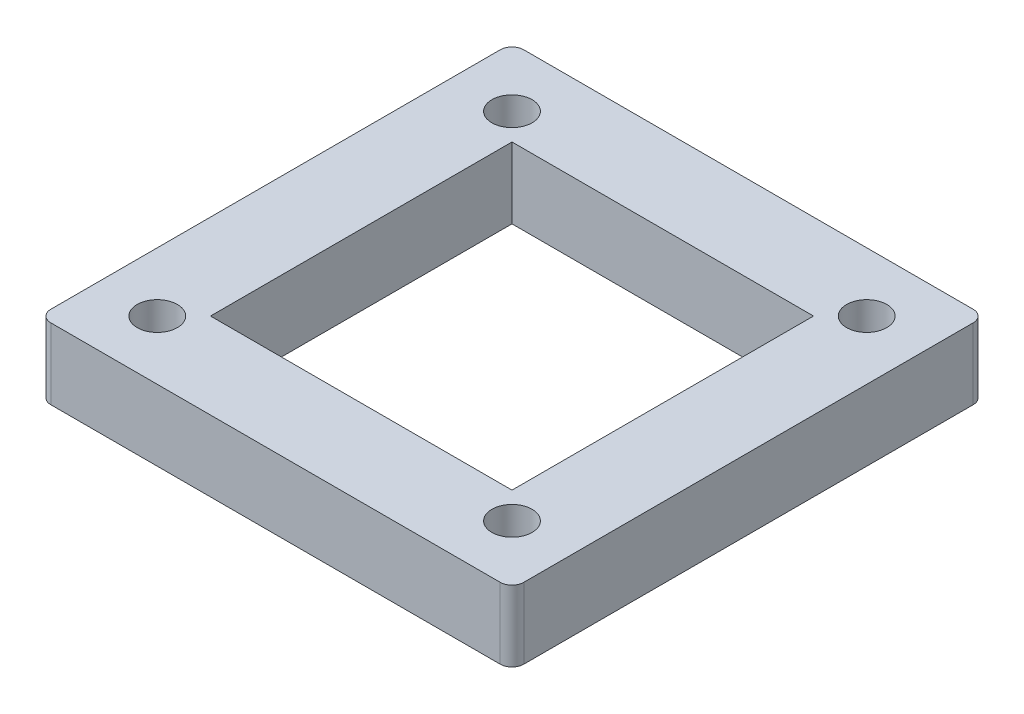
ISO-10303-21;
HEADER;
FILE_DESCRIPTION(('STEP AP214'),'2;1');
FILE_NAME('part.step','',(''),(''),'','','');
FILE_SCHEMA(('AUTOMOTIVE_DESIGN { 1 0 10303 214 1 1 1 1 }'));
ENDSEC;
DATA;
#1=APPLICATION_CONTEXT('core data for automotive mechanical design processes');
#2=APPLICATION_PROTOCOL_DEFINITION('international standard','automotive_design',2000,#1);
#3=PRODUCT_CONTEXT('',#1,'mechanical');
#4=PRODUCT('Part','Part','',(#3));
#5=PRODUCT_RELATED_PRODUCT_CATEGORY('part','',(#4));
#6=PRODUCT_DEFINITION_FORMATION('','',#4);
#7=PRODUCT_DEFINITION_CONTEXT('part definition',#1,'design');
#8=PRODUCT_DEFINITION('design','',#6,#7);
#9=PRODUCT_DEFINITION_SHAPE('','',#8);
#10=(LENGTH_UNIT() NAMED_UNIT(*) SI_UNIT(.MILLI.,.METRE.));
#11=(NAMED_UNIT(*) PLANE_ANGLE_UNIT() SI_UNIT($,.RADIAN.));
#12=(NAMED_UNIT(*) SI_UNIT($,.STERADIAN.) SOLID_ANGLE_UNIT());
#13=UNCERTAINTY_MEASURE_WITH_UNIT(LENGTH_MEASURE(1.E-05),#10,'distance_accuracy_value','');
#14=(GEOMETRIC_REPRESENTATION_CONTEXT(3) GLOBAL_UNCERTAINTY_ASSIGNED_CONTEXT((#13)) GLOBAL_UNIT_ASSIGNED_CONTEXT((#10,
#11,#12)) REPRESENTATION_CONTEXT('',''));
#15=CARTESIAN_POINT('',(0.,0.,0.));
#16=DIRECTION('',(0.,0.,1.));
#17=DIRECTION('',(1.,0.,0.));
#18=AXIS2_PLACEMENT_3D('',#15,#16,#17);
#19=CARTESIAN_POINT('',(0.,6.,0.));
#20=DIRECTION('',(0.,-1.,0.));
#21=DIRECTION('',(0.,0.,-1.));
#22=AXIS2_PLACEMENT_3D('',#19,#20,#21);
#23=PLANE('',#22);
#24=CARTESIAN_POINT('',(-15.,6.,-15.));
#25=DIRECTION('',(0.,-1.,0.));
#26=DIRECTION('',(0.,0.,-1.));
#27=AXIS2_PLACEMENT_3D('',#24,#25,#26);
#28=CIRCLE('',#27,1.7);
#29=CARTESIAN_POINT('',(-15.,6.,-16.7));
#30=VERTEX_POINT('',#29);
#31=EDGE_CURVE('E420',#30,#30,#28,.T.);
#32=ORIENTED_EDGE('',*,*,#31,.T.);
#33=EDGE_LOOP('',(#32));
#34=FACE_BOUND('',#33,.T.);
#35=CARTESIAN_POINT('',(15.,6.,-15.));
#36=DIRECTION('',(0.,-1.,0.));
#37=DIRECTION('',(0.,0.,-1.));
#38=AXIS2_PLACEMENT_3D('',#35,#36,#37);
#39=CIRCLE('',#38,1.7);
#40=CARTESIAN_POINT('',(15.,6.,-16.7));
#41=VERTEX_POINT('',#40);
#42=EDGE_CURVE('E429',#41,#41,#39,.T.);
#43=ORIENTED_EDGE('',*,*,#42,.T.);
#44=EDGE_LOOP('',(#43));
#45=FACE_BOUND('',#44,.T.);
#46=CARTESIAN_POINT('',(15.,6.,15.));
#47=DIRECTION('',(0.,-1.,0.));
#48=DIRECTION('',(0.,0.,-1.));
#49=AXIS2_PLACEMENT_3D('',#46,#47,#48);
#50=CIRCLE('',#49,1.7);
#51=CARTESIAN_POINT('',(15.,6.,13.3));
#52=VERTEX_POINT('',#51);
#53=EDGE_CURVE('E423',#52,#52,#50,.T.);
#54=ORIENTED_EDGE('',*,*,#53,.T.);
#55=EDGE_LOOP('',(#54));
#56=FACE_BOUND('',#55,.T.);
#57=CARTESIAN_POINT('',(-15.,6.,15.));
#58=DIRECTION('',(0.,-1.,0.));
#59=DIRECTION('',(0.,0.,-1.));
#60=AXIS2_PLACEMENT_3D('',#57,#58,#59);
#61=CIRCLE('',#60,1.7);
#62=CARTESIAN_POINT('',(-15.,6.,13.3));
#63=VERTEX_POINT('',#62);
#64=EDGE_CURVE('E415',#63,#63,#61,.T.);
#65=ORIENTED_EDGE('',*,*,#64,.T.);
#66=EDGE_LOOP('',(#65));
#67=FACE_BOUND('',#66,.T.);
#68=DIRECTION('',(-1.,0.,0.));
#69=VECTOR('',#68,1.);
#70=CARTESIAN_POINT('',(-20.,6.,-20.));
#71=LINE('',#70,#69);
#72=CARTESIAN_POINT('',(19.,6.,-20.));
#73=VERTEX_POINT('',#72);
#74=CARTESIAN_POINT('',(-19.,6.,-20.));
#75=VERTEX_POINT('',#74);
#76=EDGE_CURVE('E169',#73,#75,#71,.T.);
#77=ORIENTED_EDGE('',*,*,#76,.T.);
#78=CARTESIAN_POINT('',(-19.,6.,-19.));
#79=DIRECTION('',(0.,-1.,0.));
#80=DIRECTION('',(0.,0.,-1.));
#81=AXIS2_PLACEMENT_3D('',#78,#79,#80);
#82=CIRCLE('',#81,1.);
#83=CARTESIAN_POINT('',(-20.,6.,-19.));
#84=VERTEX_POINT('',#83);
#85=EDGE_CURVE('E209',#75,#84,#82,.F.);
#86=ORIENTED_EDGE('',*,*,#85,.T.);
#87=DIRECTION('',(0.,0.,1.));
#88=VECTOR('',#87,1.);
#89=CARTESIAN_POINT('',(-20.,6.,20.));
#90=LINE('',#89,#88);
#91=CARTESIAN_POINT('',(-20.,6.,19.));
#92=VERTEX_POINT('',#91);
#93=EDGE_CURVE('E173',#84,#92,#90,.T.);
#94=ORIENTED_EDGE('',*,*,#93,.T.);
#95=CARTESIAN_POINT('',(-19.,6.,19.));
#96=DIRECTION('',(0.,-1.,0.));
#97=DIRECTION('',(0.,0.,-1.));
#98=AXIS2_PLACEMENT_3D('',#95,#96,#97);
#99=CIRCLE('',#98,1.);
#100=CARTESIAN_POINT('',(-19.,6.,20.));
#101=VERTEX_POINT('',#100);
#102=EDGE_CURVE('E53',#92,#101,#99,.F.);
#103=ORIENTED_EDGE('',*,*,#102,.T.);
#104=DIRECTION('',(1.,0.,0.));
#105=VECTOR('',#104,1.);
#106=CARTESIAN_POINT('',(-20.,6.,20.));
#107=LINE('',#106,#105);
#108=CARTESIAN_POINT('',(19.,6.,20.));
#109=VERTEX_POINT('',#108);
#110=EDGE_CURVE('E175',#101,#109,#107,.T.);
#111=ORIENTED_EDGE('',*,*,#110,.T.);
#112=CARTESIAN_POINT('',(19.,6.,19.));
#113=DIRECTION('',(0.,-1.,0.));
#114=DIRECTION('',(0.,0.,-1.));
#115=AXIS2_PLACEMENT_3D('',#112,#113,#114);
#116=CIRCLE('',#115,1.);
#117=CARTESIAN_POINT('',(20.,6.,19.));
#118=VERTEX_POINT('',#117);
#119=EDGE_CURVE('E205',#109,#118,#116,.F.);
#120=ORIENTED_EDGE('',*,*,#119,.T.);
#121=DIRECTION('',(0.,0.,-1.));
#122=VECTOR('',#121,1.);
#123=CARTESIAN_POINT('',(20.,6.,20.));
#124=LINE('',#123,#122);
#125=CARTESIAN_POINT('',(20.,6.,-19.));
#126=VERTEX_POINT('',#125);
#127=EDGE_CURVE('E166',#118,#126,#124,.T.);
#128=ORIENTED_EDGE('',*,*,#127,.T.);
#129=CARTESIAN_POINT('',(19.,6.,-19.));
#130=DIRECTION('',(0.,-1.,0.));
#131=DIRECTION('',(0.,0.,-1.));
#132=AXIS2_PLACEMENT_3D('',#129,#130,#131);
#133=CIRCLE('',#132,1.);
#134=EDGE_CURVE('E207',#126,#73,#133,.F.);
#135=ORIENTED_EDGE('',*,*,#134,.T.);
#136=EDGE_LOOP('',(#77,#86,#94,#103,#111,#120,#128,#135));
#137=FACE_BOUND('',#136,.T.);
#138=DIRECTION('',(0.,0.,-1.));
#139=VECTOR('',#138,1.);
#140=CARTESIAN_POINT('',(12.75,6.,12.75));
#141=LINE('',#140,#139);
#142=CARTESIAN_POINT('',(12.75,6.,12.75));
#143=VERTEX_POINT('',#142);
#144=CARTESIAN_POINT('',(12.75,6.,-12.75));
#145=VERTEX_POINT('',#144);
#146=EDGE_CURVE('E123',#143,#145,#141,.T.);
#147=ORIENTED_EDGE('',*,*,#146,.F.);
#148=DIRECTION('',(1.,0.,0.));
#149=VECTOR('',#148,1.);
#150=CARTESIAN_POINT('',(-12.75,6.,12.75));
#151=LINE('',#150,#149);
#152=CARTESIAN_POINT('',(-12.75,6.,12.75));
#153=VERTEX_POINT('',#152);
#154=EDGE_CURVE('E148',#153,#143,#151,.T.);
#155=ORIENTED_EDGE('',*,*,#154,.F.);
#156=DIRECTION('',(0.,0.,1.));
#157=VECTOR('',#156,1.);
#158=CARTESIAN_POINT('',(-12.75,6.,12.75));
#159=LINE('',#158,#157);
#160=CARTESIAN_POINT('',(-12.75,6.,-12.75));
#161=VERTEX_POINT('',#160);
#162=EDGE_CURVE('E146',#161,#153,#159,.T.);
#163=ORIENTED_EDGE('',*,*,#162,.F.);
#164=DIRECTION('',(-1.,0.,0.));
#165=VECTOR('',#164,1.);
#166=CARTESIAN_POINT('',(-12.75,6.,-12.75));
#167=LINE('',#166,#165);
#168=EDGE_CURVE('E133',#145,#161,#167,.T.);
#169=ORIENTED_EDGE('',*,*,#168,.F.);
#170=EDGE_LOOP('',(#147,#155,#163,#169));
#171=FACE_BOUND('',#170,.T.);
#172=ADVANCED_FACE('F33',(#34,#45,#56,#67,#137,#171),#23,.F.);
#173=CARTESIAN_POINT('',(0.,0.,0.));
#174=DIRECTION('',(0.,-1.,0.));
#175=DIRECTION('',(0.,0.,-1.));
#176=AXIS2_PLACEMENT_3D('',#173,#174,#175);
#177=PLANE('',#176);
#178=CARTESIAN_POINT('',(-15.,0.,-15.));
#179=DIRECTION('',(0.,-1.,0.));
#180=DIRECTION('',(0.,0.,-1.));
#181=AXIS2_PLACEMENT_3D('',#178,#179,#180);
#182=CIRCLE('',#181,1.7);
#183=CARTESIAN_POINT('',(-15.,0.,-16.7));
#184=VERTEX_POINT('',#183);
#185=EDGE_CURVE('E417',#184,#184,#182,.T.);
#186=ORIENTED_EDGE('',*,*,#185,.F.);
#187=EDGE_LOOP('',(#186));
#188=FACE_BOUND('',#187,.T.);
#189=CARTESIAN_POINT('',(15.,0.,-15.));
#190=DIRECTION('',(0.,-1.,0.));
#191=DIRECTION('',(0.,0.,-1.));
#192=AXIS2_PLACEMENT_3D('',#189,#190,#191);
#193=CIRCLE('',#192,1.7);
#194=CARTESIAN_POINT('',(15.,0.,-16.7));
#195=VERTEX_POINT('',#194);
#196=EDGE_CURVE('E432',#195,#195,#193,.T.);
#197=ORIENTED_EDGE('',*,*,#196,.F.);
#198=EDGE_LOOP('',(#197));
#199=FACE_BOUND('',#198,.T.);
#200=CARTESIAN_POINT('',(15.,0.,15.));
#201=DIRECTION('',(0.,-1.,0.));
#202=DIRECTION('',(0.,0.,-1.));
#203=AXIS2_PLACEMENT_3D('',#200,#201,#202);
#204=CIRCLE('',#203,1.7);
#205=CARTESIAN_POINT('',(15.,0.,13.3));
#206=VERTEX_POINT('',#205);
#207=EDGE_CURVE('E426',#206,#206,#204,.T.);
#208=ORIENTED_EDGE('',*,*,#207,.F.);
#209=EDGE_LOOP('',(#208));
#210=FACE_BOUND('',#209,.T.);
#211=CARTESIAN_POINT('',(-15.,0.,15.));
#212=DIRECTION('',(0.,-1.,0.));
#213=DIRECTION('',(0.,0.,-1.));
#214=AXIS2_PLACEMENT_3D('',#211,#212,#213);
#215=CIRCLE('',#214,1.7);
#216=CARTESIAN_POINT('',(-15.,0.,13.3));
#217=VERTEX_POINT('',#216);
#218=EDGE_CURVE('E155',#217,#217,#215,.T.);
#219=ORIENTED_EDGE('',*,*,#218,.F.);
#220=EDGE_LOOP('',(#219));
#221=FACE_BOUND('',#220,.T.);
#222=DIRECTION('',(0.,0.,1.));
#223=VECTOR('',#222,1.);
#224=CARTESIAN_POINT('',(-20.,0.,20.));
#225=LINE('',#224,#223);
#226=CARTESIAN_POINT('',(-20.,0.,-19.));
#227=VERTEX_POINT('',#226);
#228=CARTESIAN_POINT('',(-20.,0.,19.));
#229=VERTEX_POINT('',#228);
#230=EDGE_CURVE('E183',#227,#229,#225,.T.);
#231=ORIENTED_EDGE('',*,*,#230,.F.);
#232=CARTESIAN_POINT('',(-19.,0.,-19.));
#233=DIRECTION('',(0.,-1.,0.));
#234=DIRECTION('',(0.,0.,-1.));
#235=AXIS2_PLACEMENT_3D('',#232,#233,#234);
#236=CIRCLE('',#235,1.);
#237=CARTESIAN_POINT('',(-19.,0.,-20.));
#238=VERTEX_POINT('',#237);
#239=EDGE_CURVE('E197',#227,#238,#236,.T.);
#240=ORIENTED_EDGE('',*,*,#239,.T.);
#241=DIRECTION('',(-1.,0.,0.));
#242=VECTOR('',#241,1.);
#243=CARTESIAN_POINT('',(-20.,0.,-20.));
#244=LINE('',#243,#242);
#245=CARTESIAN_POINT('',(19.,0.,-20.));
#246=VERTEX_POINT('',#245);
#247=EDGE_CURVE('E180',#246,#238,#244,.T.);
#248=ORIENTED_EDGE('',*,*,#247,.F.);
#249=CARTESIAN_POINT('',(19.,0.,-19.));
#250=DIRECTION('',(0.,-1.,0.));
#251=DIRECTION('',(0.,0.,-1.));
#252=AXIS2_PLACEMENT_3D('',#249,#250,#251);
#253=CIRCLE('',#252,1.);
#254=CARTESIAN_POINT('',(20.,0.,-19.));
#255=VERTEX_POINT('',#254);
#256=EDGE_CURVE('E195',#246,#255,#253,.T.);
#257=ORIENTED_EDGE('',*,*,#256,.T.);
#258=DIRECTION('',(0.,0.,-1.));
#259=VECTOR('',#258,1.);
#260=CARTESIAN_POINT('',(20.,0.,20.));
#261=LINE('',#260,#259);
#262=CARTESIAN_POINT('',(20.,0.,19.));
#263=VERTEX_POINT('',#262);
#264=EDGE_CURVE('E141',#263,#255,#261,.T.);
#265=ORIENTED_EDGE('',*,*,#264,.F.);
#266=CARTESIAN_POINT('',(19.,0.,19.));
#267=DIRECTION('',(0.,-1.,0.));
#268=DIRECTION('',(0.,0.,-1.));
#269=AXIS2_PLACEMENT_3D('',#266,#267,#268);
#270=CIRCLE('',#269,1.);
#271=CARTESIAN_POINT('',(19.,0.,20.));
#272=VERTEX_POINT('',#271);
#273=EDGE_CURVE('E193',#263,#272,#270,.T.);
#274=ORIENTED_EDGE('',*,*,#273,.T.);
#275=DIRECTION('',(1.,0.,0.));
#276=VECTOR('',#275,1.);
#277=CARTESIAN_POINT('',(-20.,0.,20.));
#278=LINE('',#277,#276);
#279=CARTESIAN_POINT('',(-19.,0.,20.));
#280=VERTEX_POINT('',#279);
#281=EDGE_CURVE('E170',#280,#272,#278,.T.);
#282=ORIENTED_EDGE('',*,*,#281,.F.);
#283=CARTESIAN_POINT('',(-19.,0.,19.));
#284=DIRECTION('',(0.,-1.,0.));
#285=DIRECTION('',(0.,0.,-1.));
#286=AXIS2_PLACEMENT_3D('',#283,#284,#285);
#287=CIRCLE('',#286,1.);
#288=EDGE_CURVE('E191',#280,#229,#287,.T.);
#289=ORIENTED_EDGE('',*,*,#288,.T.);
#290=EDGE_LOOP('',(#231,#240,#248,#257,#265,#274,#282,#289));
#291=FACE_BOUND('',#290,.T.);
#292=DIRECTION('',(1.,0.,0.));
#293=VECTOR('',#292,1.);
#294=CARTESIAN_POINT('',(-12.75,0.,12.75));
#295=LINE('',#294,#293);
#296=CARTESIAN_POINT('',(-12.75,0.,12.75));
#297=VERTEX_POINT('',#296);
#298=CARTESIAN_POINT('',(12.75,0.,12.75));
#299=VERTEX_POINT('',#298);
#300=EDGE_CURVE('E134',#297,#299,#295,.T.);
#301=ORIENTED_EDGE('',*,*,#300,.T.);
#302=DIRECTION('',(0.,0.,-1.));
#303=VECTOR('',#302,1.);
#304=CARTESIAN_POINT('',(12.75,0.,12.75));
#305=LINE('',#304,#303);
#306=CARTESIAN_POINT('',(12.75,0.,-12.75));
#307=VERTEX_POINT('',#306);
#308=EDGE_CURVE('E153',#299,#307,#305,.T.);
#309=ORIENTED_EDGE('',*,*,#308,.T.);
#310=DIRECTION('',(-1.,0.,0.));
#311=VECTOR('',#310,1.);
#312=CARTESIAN_POINT('',(-12.75,0.,-12.75));
#313=LINE('',#312,#311);
#314=CARTESIAN_POINT('',(-12.75,0.,-12.75));
#315=VERTEX_POINT('',#314);
#316=EDGE_CURVE('E140',#307,#315,#313,.T.);
#317=ORIENTED_EDGE('',*,*,#316,.T.);
#318=DIRECTION('',(0.,0.,1.));
#319=VECTOR('',#318,1.);
#320=CARTESIAN_POINT('',(-12.75,0.,12.75));
#321=LINE('',#320,#319);
#322=EDGE_CURVE('E157',#315,#297,#321,.T.);
#323=ORIENTED_EDGE('',*,*,#322,.T.);
#324=EDGE_LOOP('',(#301,#309,#317,#323));
#325=FACE_BOUND('',#324,.T.);
#326=ADVANCED_FACE('F222',(#188,#199,#210,#221,#291,#325),#177,.T.);
#327=CARTESIAN_POINT('',(20.,6.,20.));
#328=DIRECTION('',(-1.,0.,0.));
#329=DIRECTION('',(0.,0.,1.));
#330=AXIS2_PLACEMENT_3D('',#327,#328,#329);
#331=PLANE('',#330);
#332=ORIENTED_EDGE('',*,*,#264,.T.);
#333=DIRECTION('',(0.,-1.,0.));
#334=VECTOR('',#333,1.);
#335=CARTESIAN_POINT('',(20.,6.,-19.));
#336=LINE('',#335,#334);
#337=EDGE_CURVE('E214',#255,#126,#336,.F.);
#338=ORIENTED_EDGE('',*,*,#337,.T.);
#339=ORIENTED_EDGE('',*,*,#127,.F.);
#340=DIRECTION('',(0.,-1.,0.));
#341=VECTOR('',#340,1.);
#342=CARTESIAN_POINT('',(20.,6.,19.));
#343=LINE('',#342,#341);
#344=EDGE_CURVE('E211',#118,#263,#343,.T.);
#345=ORIENTED_EDGE('',*,*,#344,.T.);
#346=EDGE_LOOP('',(#332,#338,#339,#345));
#347=FACE_BOUND('',#346,.T.);
#348=ADVANCED_FACE('F231',(#347),#331,.F.);
#349=CARTESIAN_POINT('',(-20.,6.,-20.));
#350=DIRECTION('',(0.,0.,1.));
#351=DIRECTION('',(1.,0.,0.));
#352=AXIS2_PLACEMENT_3D('',#349,#350,#351);
#353=PLANE('',#352);
#354=ORIENTED_EDGE('',*,*,#247,.T.);
#355=DIRECTION('',(0.,-1.,0.));
#356=VECTOR('',#355,1.);
#357=CARTESIAN_POINT('',(-19.,6.,-20.));
#358=LINE('',#357,#356);
#359=EDGE_CURVE('E202',#238,#75,#358,.F.);
#360=ORIENTED_EDGE('',*,*,#359,.T.);
#361=ORIENTED_EDGE('',*,*,#76,.F.);
#362=DIRECTION('',(0.,-1.,0.));
#363=VECTOR('',#362,1.);
#364=CARTESIAN_POINT('',(19.,6.,-20.));
#365=LINE('',#364,#363);
#366=EDGE_CURVE('E199',#73,#246,#365,.T.);
#367=ORIENTED_EDGE('',*,*,#366,.T.);
#368=EDGE_LOOP('',(#354,#360,#361,#367));
#369=FACE_BOUND('',#368,.T.);
#370=ADVANCED_FACE('F240',(#369),#353,.F.);
#371=CARTESIAN_POINT('',(-20.,6.,20.));
#372=DIRECTION('',(1.,0.,0.));
#373=DIRECTION('',(0.,0.,-1.));
#374=AXIS2_PLACEMENT_3D('',#371,#372,#373);
#375=PLANE('',#374);
#376=ORIENTED_EDGE('',*,*,#93,.F.);
#377=DIRECTION('',(0.,-1.,0.));
#378=VECTOR('',#377,1.);
#379=CARTESIAN_POINT('',(-20.,6.,-19.));
#380=LINE('',#379,#378);
#381=EDGE_CURVE('E188',#84,#227,#380,.T.);
#382=ORIENTED_EDGE('',*,*,#381,.T.);
#383=ORIENTED_EDGE('',*,*,#230,.T.);
#384=DIRECTION('',(0.,-1.,0.));
#385=VECTOR('',#384,1.);
#386=CARTESIAN_POINT('',(-20.,6.,19.));
#387=LINE('',#386,#385);
#388=EDGE_CURVE('E177',#229,#92,#387,.F.);
#389=ORIENTED_EDGE('',*,*,#388,.T.);
#390=EDGE_LOOP('',(#376,#382,#383,#389));
#391=FACE_BOUND('',#390,.T.);
#392=ADVANCED_FACE('F248',(#391),#375,.F.);
#393=CARTESIAN_POINT('',(-20.,6.,20.));
#394=DIRECTION('',(0.,0.,-1.));
#395=DIRECTION('',(-1.,0.,0.));
#396=AXIS2_PLACEMENT_3D('',#393,#394,#395);
#397=PLANE('',#396);
#398=ORIENTED_EDGE('',*,*,#281,.T.);
#399=DIRECTION('',(0.,-1.,0.));
#400=VECTOR('',#399,1.);
#401=CARTESIAN_POINT('',(19.,6.,20.));
#402=LINE('',#401,#400);
#403=EDGE_CURVE('E11',#272,#109,#402,.F.);
#404=ORIENTED_EDGE('',*,*,#403,.T.);
#405=ORIENTED_EDGE('',*,*,#110,.F.);
#406=DIRECTION('',(0.,-1.,0.));
#407=VECTOR('',#406,1.);
#408=CARTESIAN_POINT('',(-19.,6.,20.));
#409=LINE('',#408,#407);
#410=EDGE_CURVE('E41',#101,#280,#409,.T.);
#411=ORIENTED_EDGE('',*,*,#410,.T.);
#412=EDGE_LOOP('',(#398,#404,#405,#411));
#413=FACE_BOUND('',#412,.T.);
#414=ADVANCED_FACE('F218',(#413),#397,.F.);
#415=CARTESIAN_POINT('',(12.75,6.,12.75));
#416=DIRECTION('',(-1.,0.,0.));
#417=DIRECTION('',(0.,0.,1.));
#418=AXIS2_PLACEMENT_3D('',#415,#416,#417);
#419=PLANE('',#418);
#420=ORIENTED_EDGE('',*,*,#308,.F.);
#421=DIRECTION('',(0.,-1.,0.));
#422=VECTOR('',#421,1.);
#423=CARTESIAN_POINT('',(12.75,6.,12.75));
#424=LINE('',#423,#422);
#425=EDGE_CURVE('E129',#143,#299,#424,.T.);
#426=ORIENTED_EDGE('',*,*,#425,.F.);
#427=ORIENTED_EDGE('',*,*,#146,.T.);
#428=DIRECTION('',(0.,-1.,0.));
#429=VECTOR('',#428,1.);
#430=CARTESIAN_POINT('',(12.75,6.,-12.75));
#431=LINE('',#430,#429);
#432=EDGE_CURVE('E126',#145,#307,#431,.T.);
#433=ORIENTED_EDGE('',*,*,#432,.T.);
#434=EDGE_LOOP('',(#420,#426,#427,#433));
#435=FACE_BOUND('',#434,.T.);
#436=ADVANCED_FACE('F125',(#435),#419,.T.);
#437=CARTESIAN_POINT('',(-12.75,6.,-12.75));
#438=DIRECTION('',(0.,0.,1.));
#439=DIRECTION('',(1.,0.,0.));
#440=AXIS2_PLACEMENT_3D('',#437,#438,#439);
#441=PLANE('',#440);
#442=ORIENTED_EDGE('',*,*,#316,.F.);
#443=ORIENTED_EDGE('',*,*,#432,.F.);
#444=ORIENTED_EDGE('',*,*,#168,.T.);
#445=DIRECTION('',(0.,-1.,0.));
#446=VECTOR('',#445,1.);
#447=CARTESIAN_POINT('',(-12.75,6.,-12.75));
#448=LINE('',#447,#446);
#449=EDGE_CURVE('E142',#161,#315,#448,.T.);
#450=ORIENTED_EDGE('',*,*,#449,.T.);
#451=EDGE_LOOP('',(#442,#443,#444,#450));
#452=FACE_BOUND('',#451,.T.);
#453=ADVANCED_FACE('F137',(#452),#441,.T.);
#454=CARTESIAN_POINT('',(-12.75,6.,12.75));
#455=DIRECTION('',(1.,0.,0.));
#456=DIRECTION('',(0.,0.,-1.));
#457=AXIS2_PLACEMENT_3D('',#454,#455,#456);
#458=PLANE('',#457);
#459=ORIENTED_EDGE('',*,*,#322,.F.);
#460=ORIENTED_EDGE('',*,*,#449,.F.);
#461=ORIENTED_EDGE('',*,*,#162,.T.);
#462=DIRECTION('',(0.,-1.,0.));
#463=VECTOR('',#462,1.);
#464=CARTESIAN_POINT('',(-12.75,6.,12.75));
#465=LINE('',#464,#463);
#466=EDGE_CURVE('E163',#153,#297,#465,.T.);
#467=ORIENTED_EDGE('',*,*,#466,.T.);
#468=EDGE_LOOP('',(#459,#460,#461,#467));
#469=FACE_BOUND('',#468,.T.);
#470=ADVANCED_FACE('F344',(#469),#458,.T.);
#471=CARTESIAN_POINT('',(-12.75,6.,12.75));
#472=DIRECTION('',(0.,0.,-1.));
#473=DIRECTION('',(-1.,0.,0.));
#474=AXIS2_PLACEMENT_3D('',#471,#472,#473);
#475=PLANE('',#474);
#476=ORIENTED_EDGE('',*,*,#300,.F.);
#477=ORIENTED_EDGE('',*,*,#466,.F.);
#478=ORIENTED_EDGE('',*,*,#154,.T.);
#479=ORIENTED_EDGE('',*,*,#425,.T.);
#480=EDGE_LOOP('',(#476,#477,#478,#479));
#481=FACE_BOUND('',#480,.T.);
#482=ADVANCED_FACE('F335',(#481),#475,.T.);
#483=CARTESIAN_POINT('',(-15.,0.,15.));
#484=DIRECTION('',(0.,1.,0.));
#485=DIRECTION('',(0.,0.,1.));
#486=AXIS2_PLACEMENT_3D('',#483,#484,#485);
#487=CYLINDRICAL_SURFACE('',#486,1.7);
#488=ORIENTED_EDGE('',*,*,#218,.T.);
#489=EDGE_LOOP('',(#488));
#490=FACE_BOUND('',#489,.T.);
#491=ORIENTED_EDGE('',*,*,#64,.F.);
#492=EDGE_LOOP('',(#491));
#493=FACE_BOUND('',#492,.T.);
#494=ADVANCED_FACE('F326',(#490,#493),#487,.F.);
#495=CARTESIAN_POINT('',(15.,0.,15.));
#496=DIRECTION('',(0.,1.,0.));
#497=DIRECTION('',(0.,0.,1.));
#498=AXIS2_PLACEMENT_3D('',#495,#496,#497);
#499=CYLINDRICAL_SURFACE('',#498,1.7);
#500=ORIENTED_EDGE('',*,*,#207,.T.);
#501=EDGE_LOOP('',(#500));
#502=FACE_BOUND('',#501,.T.);
#503=ORIENTED_EDGE('',*,*,#53,.F.);
#504=EDGE_LOOP('',(#503));
#505=FACE_BOUND('',#504,.T.);
#506=ADVANCED_FACE('F317',(#502,#505),#499,.F.);
#507=CARTESIAN_POINT('',(15.,0.,-15.));
#508=DIRECTION('',(0.,1.,0.));
#509=DIRECTION('',(0.,0.,1.));
#510=AXIS2_PLACEMENT_3D('',#507,#508,#509);
#511=CYLINDRICAL_SURFACE('',#510,1.7);
#512=ORIENTED_EDGE('',*,*,#196,.T.);
#513=EDGE_LOOP('',(#512));
#514=FACE_BOUND('',#513,.T.);
#515=ORIENTED_EDGE('',*,*,#42,.F.);
#516=EDGE_LOOP('',(#515));
#517=FACE_BOUND('',#516,.T.);
#518=ADVANCED_FACE('F308',(#514,#517),#511,.F.);
#519=CARTESIAN_POINT('',(-15.,0.,-15.));
#520=DIRECTION('',(0.,1.,0.));
#521=DIRECTION('',(0.,0.,1.));
#522=AXIS2_PLACEMENT_3D('',#519,#520,#521);
#523=CYLINDRICAL_SURFACE('',#522,1.7);
#524=ORIENTED_EDGE('',*,*,#185,.T.);
#525=EDGE_LOOP('',(#524));
#526=FACE_BOUND('',#525,.T.);
#527=ORIENTED_EDGE('',*,*,#31,.F.);
#528=EDGE_LOOP('',(#527));
#529=FACE_BOUND('',#528,.T.);
#530=ADVANCED_FACE('F277',(#526,#529),#523,.F.);
#531=CARTESIAN_POINT('',(-19.,6.,-19.));
#532=DIRECTION('',(0.,-1.,0.));
#533=DIRECTION('',(0.,0.,-1.));
#534=AXIS2_PLACEMENT_3D('',#531,#532,#533);
#535=CYLINDRICAL_SURFACE('',#534,1.);
#536=ORIENTED_EDGE('',*,*,#85,.F.);
#537=ORIENTED_EDGE('',*,*,#359,.F.);
#538=ORIENTED_EDGE('',*,*,#239,.F.);
#539=ORIENTED_EDGE('',*,*,#381,.F.);
#540=EDGE_LOOP('',(#536,#537,#538,#539));
#541=FACE_BOUND('',#540,.T.);
#542=ADVANCED_FACE('F245',(#541),#535,.T.);
#543=CARTESIAN_POINT('',(19.,6.,-19.));
#544=DIRECTION('',(0.,-1.,0.));
#545=DIRECTION('',(0.,0.,-1.));
#546=AXIS2_PLACEMENT_3D('',#543,#544,#545);
#547=CYLINDRICAL_SURFACE('',#546,1.);
#548=ORIENTED_EDGE('',*,*,#134,.F.);
#549=ORIENTED_EDGE('',*,*,#337,.F.);
#550=ORIENTED_EDGE('',*,*,#256,.F.);
#551=ORIENTED_EDGE('',*,*,#366,.F.);
#552=EDGE_LOOP('',(#548,#549,#550,#551));
#553=FACE_BOUND('',#552,.T.);
#554=ADVANCED_FACE('F237',(#553),#547,.T.);
#555=CARTESIAN_POINT('',(19.,6.,19.));
#556=DIRECTION('',(0.,-1.,0.));
#557=DIRECTION('',(0.,0.,-1.));
#558=AXIS2_PLACEMENT_3D('',#555,#556,#557);
#559=CYLINDRICAL_SURFACE('',#558,1.);
#560=ORIENTED_EDGE('',*,*,#119,.F.);
#561=ORIENTED_EDGE('',*,*,#403,.F.);
#562=ORIENTED_EDGE('',*,*,#273,.F.);
#563=ORIENTED_EDGE('',*,*,#344,.F.);
#564=EDGE_LOOP('',(#560,#561,#562,#563));
#565=FACE_BOUND('',#564,.T.);
#566=ADVANCED_FACE('F228',(#565),#559,.T.);
#567=CARTESIAN_POINT('',(-19.,6.,19.));
#568=DIRECTION('',(0.,-1.,0.));
#569=DIRECTION('',(0.,0.,-1.));
#570=AXIS2_PLACEMENT_3D('',#567,#568,#569);
#571=CYLINDRICAL_SURFACE('',#570,1.);
#572=ORIENTED_EDGE('',*,*,#102,.F.);
#573=ORIENTED_EDGE('',*,*,#388,.F.);
#574=ORIENTED_EDGE('',*,*,#288,.F.);
#575=ORIENTED_EDGE('',*,*,#410,.F.);
#576=EDGE_LOOP('',(#572,#573,#574,#575));
#577=FACE_BOUND('',#576,.T.);
#578=ADVANCED_FACE('F35',(#577),#571,.T.);
#579=CLOSED_SHELL('',(#172,#326,#348,#370,#392,#414,#436,#453,#470,#482,#494,#506,#518,#530,
#542,#554,#566,#578));
#580=MANIFOLD_SOLID_BREP('B2',#579);
#581=ADVANCED_BREP_SHAPE_REPRESENTATION('',(#18,#580),#14);
#582=SHAPE_DEFINITION_REPRESENTATION(#9,#581);
ENDSEC;
END-ISO-10303-21;
